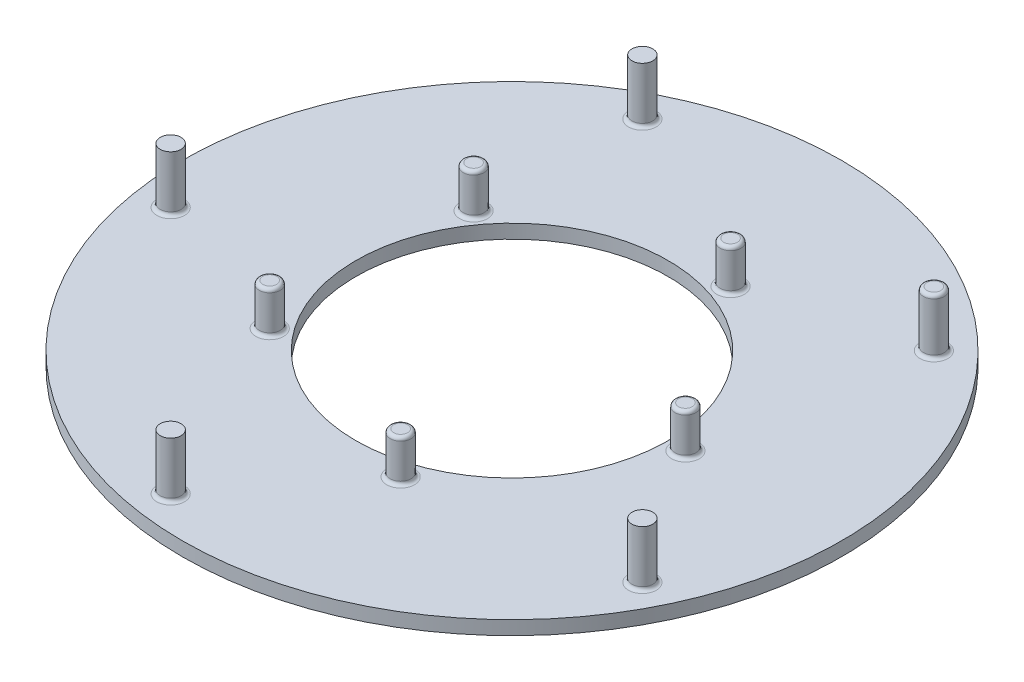
ISO-10303-21;
HEADER;
FILE_DESCRIPTION(('STEP AP214'),'2;1');
FILE_NAME('part.step','',(''),(''),'','','');
FILE_SCHEMA(('AUTOMOTIVE_DESIGN { 1 0 10303 214 1 1 1 1 }'));
ENDSEC;
DATA;
#1=APPLICATION_CONTEXT('core data for automotive mechanical design processes');
#2=APPLICATION_PROTOCOL_DEFINITION('international standard','automotive_design',2000,#1);
#3=PRODUCT_CONTEXT('',#1,'mechanical');
#4=PRODUCT('Part','Part','',(#3));
#5=PRODUCT_RELATED_PRODUCT_CATEGORY('part','',(#4));
#6=PRODUCT_DEFINITION_FORMATION('','',#4);
#7=PRODUCT_DEFINITION_CONTEXT('part definition',#1,'design');
#8=PRODUCT_DEFINITION('design','',#6,#7);
#9=PRODUCT_DEFINITION_SHAPE('','',#8);
#10=(LENGTH_UNIT() NAMED_UNIT(*) SI_UNIT(.MILLI.,.METRE.));
#11=(NAMED_UNIT(*) PLANE_ANGLE_UNIT() SI_UNIT($,.RADIAN.));
#12=(NAMED_UNIT(*) SI_UNIT($,.STERADIAN.) SOLID_ANGLE_UNIT());
#13=UNCERTAINTY_MEASURE_WITH_UNIT(LENGTH_MEASURE(1.E-05),#10,'distance_accuracy_value','');
#14=(GEOMETRIC_REPRESENTATION_CONTEXT(3) GLOBAL_UNCERTAINTY_ASSIGNED_CONTEXT((#13)) GLOBAL_UNIT_ASSIGNED_CONTEXT((#10,
#11,#12)) REPRESENTATION_CONTEXT('',''));
#15=CARTESIAN_POINT('',(0.,0.,0.));
#16=DIRECTION('',(0.,0.,1.));
#17=DIRECTION('',(1.,0.,0.));
#18=AXIS2_PLACEMENT_3D('',#15,#16,#17);
#19=CARTESIAN_POINT('',(0.,2.,0.));
#20=DIRECTION('',(0.,1.,0.));
#21=DIRECTION('',(0.,0.,1.));
#22=AXIS2_PLACEMENT_3D('',#19,#20,#21);
#23=PLANE('',#22);
#24=CARTESIAN_POINT('',(38.3132805401001,2.,19.5215914888));
#25=DIRECTION('',(0.,1.,0.));
#26=DIRECTION('',(0.,0.,1.));
#27=AXIS2_PLACEMENT_3D('',#24,#25,#26);
#28=CIRCLE('',#27,2.00000000000001);
#29=CARTESIAN_POINT('',(38.3132805401001,2.,21.5215914888));
#30=VERTEX_POINT('',#29);
#31=EDGE_CURVE('E10',#30,#30,#28,.F.);
#32=ORIENTED_EDGE('',*,*,#31,.T.);
#33=EDGE_LOOP('',(#32));
#34=FACE_BOUND('',#33,.T.);
#35=CARTESIAN_POINT('',(7.72542485937396,2.,23.7764129073788));
#36=DIRECTION('',(0.,1.,0.));
#37=DIRECTION('',(0.,0.,1.));
#38=AXIS2_PLACEMENT_3D('',#35,#36,#37);
#39=CIRCLE('',#38,2.);
#40=CARTESIAN_POINT('',(7.72542485937396,2.,25.7764129073788));
#41=VERTEX_POINT('',#40);
#42=EDGE_CURVE('E40',#41,#41,#39,.F.);
#43=ORIENTED_EDGE('',*,*,#42,.T.);
#44=EDGE_LOOP('',(#43));
#45=FACE_BOUND('',#44,.T.);
#46=CARTESIAN_POINT('',(-6.72668199672947,2.,42.470598645591));
#47=DIRECTION('',(0.,1.,0.));
#48=DIRECTION('',(0.,0.,1.));
#49=AXIS2_PLACEMENT_3D('',#46,#47,#48);
#50=CIRCLE('',#49,2.00000000000001);
#51=CARTESIAN_POINT('',(-6.72668199672947,2.,44.470598645591));
#52=VERTEX_POINT('',#51);
#53=EDGE_CURVE('E59',#52,#52,#50,.F.);
#54=ORIENTED_EDGE('',*,*,#53,.T.);
#55=EDGE_LOOP('',(#54));
#56=FACE_BOUND('',#55,.T.);
#57=CARTESIAN_POINT('',(-20.2254248593736,2.,14.694631307312));
#58=DIRECTION('',(0.,1.,0.));
#59=DIRECTION('',(0.,0.,1.));
#60=AXIS2_PLACEMENT_3D('',#57,#58,#59);
#61=CIRCLE('',#60,2.);
#62=CARTESIAN_POINT('',(-20.2254248593736,2.,16.694631307312));
#63=VERTEX_POINT('',#62);
#64=EDGE_CURVE('E62',#63,#63,#61,.F.);
#65=ORIENTED_EDGE('',*,*,#64,.T.);
#66=EDGE_LOOP('',(#65));
#67=FACE_BOUND('',#66,.T.);
#68=CARTESIAN_POINT('',(-42.4705986455909,2.,6.72668199673025));
#69=DIRECTION('',(0.,1.,0.));
#70=DIRECTION('',(0.,0.,1.));
#71=AXIS2_PLACEMENT_3D('',#68,#69,#70);
#72=CIRCLE('',#71,2.00000000000001);
#73=CARTESIAN_POINT('',(-42.4705986455909,2.,8.72668199673025));
#74=VERTEX_POINT('',#73);
#75=EDGE_CURVE('E77',#74,#74,#72,.F.);
#76=ORIENTED_EDGE('',*,*,#75,.T.);
#77=EDGE_LOOP('',(#76));
#78=FACE_BOUND('',#77,.T.);
#79=CARTESIAN_POINT('',(-20.2254248593738,2.,-14.6946313073117));
#80=DIRECTION('',(0.,1.,0.));
#81=DIRECTION('',(0.,0.,1.));
#82=AXIS2_PLACEMENT_3D('',#79,#80,#81);
#83=CIRCLE('',#82,2.);
#84=CARTESIAN_POINT('',(-20.2254248593738,2.,-12.6946313073117));
#85=VERTEX_POINT('',#84);
#86=EDGE_CURVE('E80',#85,#85,#83,.F.);
#87=ORIENTED_EDGE('',*,*,#86,.T.);
#88=EDGE_LOOP('',(#87));
#89=FACE_BOUND('',#88,.T.);
#90=CARTESIAN_POINT('',(-19.5215914888007,2.,-38.3132805400997));
#91=DIRECTION('',(0.,1.,0.));
#92=DIRECTION('',(0.,0.,1.));
#93=AXIS2_PLACEMENT_3D('',#90,#91,#92);
#94=CIRCLE('',#93,2.00000000000001);
#95=CARTESIAN_POINT('',(-19.5215914888007,2.,-36.3132805400997));
#96=VERTEX_POINT('',#95);
#97=EDGE_CURVE('E95',#96,#96,#94,.F.);
#98=ORIENTED_EDGE('',*,*,#97,.T.);
#99=EDGE_LOOP('',(#98));
#100=FACE_BOUND('',#99,.T.);
#101=CARTESIAN_POINT('',(7.72542485937362,2.,-23.7764129073789));
#102=DIRECTION('',(0.,1.,0.));
#103=DIRECTION('',(0.,0.,1.));
#104=AXIS2_PLACEMENT_3D('',#101,#102,#103);
#105=CIRCLE('',#104,2.);
#106=CARTESIAN_POINT('',(7.72542485937362,2.,-21.7764129073789));
#107=VERTEX_POINT('',#106);
#108=EDGE_CURVE('E98',#107,#107,#105,.F.);
#109=ORIENTED_EDGE('',*,*,#108,.T.);
#110=EDGE_LOOP('',(#109));
#111=FACE_BOUND('',#110,.T.);
#112=CARTESIAN_POINT('',(30.4055915910215,2.,-30.4055915910216));
#113=DIRECTION('',(0.,1.,0.));
#114=DIRECTION('',(0.,0.,1.));
#115=AXIS2_PLACEMENT_3D('',#112,#113,#114);
#116=CIRCLE('',#115,2.00000000000001);
#117=CARTESIAN_POINT('',(30.4055915910215,2.,-28.4055915910216));
#118=VERTEX_POINT('',#117);
#119=EDGE_CURVE('E119',#118,#118,#116,.F.);
#120=ORIENTED_EDGE('',*,*,#119,.T.);
#121=EDGE_LOOP('',(#120));
#122=FACE_BOUND('',#121,.T.);
#123=CARTESIAN_POINT('',(25.,2.,0.));
#124=DIRECTION('',(0.,1.,0.));
#125=DIRECTION('',(0.,0.,1.));
#126=AXIS2_PLACEMENT_3D('',#123,#124,#125);
#127=CIRCLE('',#126,2.);
#128=CARTESIAN_POINT('',(25.,2.,2.));
#129=VERTEX_POINT('',#128);
#130=EDGE_CURVE('E122',#129,#129,#127,.F.);
#131=ORIENTED_EDGE('',*,*,#130,.T.);
#132=EDGE_LOOP('',(#131));
#133=FACE_BOUND('',#132,.T.);
#134=CARTESIAN_POINT('',(0.,2.,0.));
#135=DIRECTION('',(0.,1.,0.));
#136=DIRECTION('',(0.,0.,1.));
#137=AXIS2_PLACEMENT_3D('',#134,#135,#136);
#138=CIRCLE('',#137,47.5);
#139=CARTESIAN_POINT('',(0.,2.,47.5));
#140=VERTEX_POINT('',#139);
#141=EDGE_CURVE('E137',#140,#140,#138,.T.);
#142=ORIENTED_EDGE('',*,*,#141,.T.);
#143=EDGE_LOOP('',(#142));
#144=FACE_BOUND('',#143,.T.);
#145=CARTESIAN_POINT('',(0.,2.,0.));
#146=DIRECTION('',(0.,1.,0.));
#147=DIRECTION('',(0.,0.,1.));
#148=AXIS2_PLACEMENT_3D('',#145,#146,#147);
#149=CIRCLE('',#148,22.5);
#150=CARTESIAN_POINT('',(0.,2.,22.5));
#151=VERTEX_POINT('',#150);
#152=EDGE_CURVE('E141',#151,#151,#149,.T.);
#153=ORIENTED_EDGE('',*,*,#152,.F.);
#154=EDGE_LOOP('',(#153));
#155=FACE_BOUND('',#154,.T.);
#156=ADVANCED_FACE('F33',(#34,#45,#56,#67,#78,#89,#100,#111,#122,#133,#144,#155),#23,.T.);
#157=CARTESIAN_POINT('',(0.,0.,0.));
#158=DIRECTION('',(0.,1.,0.));
#159=DIRECTION('',(0.,0.,1.));
#160=AXIS2_PLACEMENT_3D('',#157,#158,#159);
#161=PLANE('',#160);
#162=CARTESIAN_POINT('',(0.,0.,0.));
#163=DIRECTION('',(0.,1.,0.));
#164=DIRECTION('',(0.,0.,1.));
#165=AXIS2_PLACEMENT_3D('',#162,#163,#164);
#166=CIRCLE('',#165,47.5);
#167=CARTESIAN_POINT('',(0.,0.,47.5));
#168=VERTEX_POINT('',#167);
#169=EDGE_CURVE('E138',#168,#168,#166,.T.);
#170=ORIENTED_EDGE('',*,*,#169,.F.);
#171=EDGE_LOOP('',(#170));
#172=FACE_BOUND('',#171,.T.);
#173=CARTESIAN_POINT('',(0.,0.,0.));
#174=DIRECTION('',(0.,1.,0.));
#175=DIRECTION('',(0.,0.,1.));
#176=AXIS2_PLACEMENT_3D('',#173,#174,#175);
#177=CIRCLE('',#176,22.5);
#178=CARTESIAN_POINT('',(0.,0.,22.5));
#179=VERTEX_POINT('',#178);
#180=EDGE_CURVE('E144',#179,#179,#177,.T.);
#181=ORIENTED_EDGE('',*,*,#180,.T.);
#182=EDGE_LOOP('',(#181));
#183=FACE_BOUND('',#182,.T.);
#184=ADVANCED_FACE('F182',(#172,#183),#161,.F.);
#185=CARTESIAN_POINT('',(0.,2.,0.));
#186=DIRECTION('',(0.,-1.,0.));
#187=DIRECTION('',(0.,0.,-1.));
#188=AXIS2_PLACEMENT_3D('',#185,#186,#187);
#189=CYLINDRICAL_SURFACE('',#188,47.5);
#190=ORIENTED_EDGE('',*,*,#141,.F.);
#191=EDGE_LOOP('',(#190));
#192=FACE_BOUND('',#191,.T.);
#193=ORIENTED_EDGE('',*,*,#169,.T.);
#194=EDGE_LOOP('',(#193));
#195=FACE_BOUND('',#194,.T.);
#196=ADVANCED_FACE('F187',(#192,#195),#189,.T.);
#197=CARTESIAN_POINT('',(0.,2.,0.));
#198=DIRECTION('',(0.,-1.,0.));
#199=DIRECTION('',(0.,0.,-1.));
#200=AXIS2_PLACEMENT_3D('',#197,#198,#199);
#201=CYLINDRICAL_SURFACE('',#200,22.5);
#202=ORIENTED_EDGE('',*,*,#152,.T.);
#203=EDGE_LOOP('',(#202));
#204=FACE_BOUND('',#203,.T.);
#205=ORIENTED_EDGE('',*,*,#180,.F.);
#206=EDGE_LOOP('',(#205));
#207=FACE_BOUND('',#206,.T.);
#208=ADVANCED_FACE('F191',(#204,#207),#201,.F.);
#209=CARTESIAN_POINT('',(25.,8.,0.));
#210=DIRECTION('',(0.,-1.,0.));
#211=DIRECTION('',(0.,0.,-1.));
#212=AXIS2_PLACEMENT_3D('',#209,#210,#211);
#213=CYLINDRICAL_SURFACE('',#212,1.5);
#214=CARTESIAN_POINT('',(25.,7.5,0.));
#215=DIRECTION('',(0.,1.,0.));
#216=DIRECTION('',(0.,0.,1.));
#217=AXIS2_PLACEMENT_3D('',#214,#215,#216);
#218=CIRCLE('',#217,1.5);
#219=CARTESIAN_POINT('',(25.,7.5,1.5));
#220=VERTEX_POINT('',#219);
#221=EDGE_CURVE('E128',#220,#220,#218,.F.);
#222=ORIENTED_EDGE('',*,*,#221,.T.);
#223=EDGE_LOOP('',(#222));
#224=FACE_BOUND('',#223,.T.);
#225=CARTESIAN_POINT('',(25.,2.5,0.));
#226=DIRECTION('',(0.,1.,0.));
#227=DIRECTION('',(0.,0.,1.));
#228=AXIS2_PLACEMENT_3D('',#225,#226,#227);
#229=CIRCLE('',#228,1.5);
#230=CARTESIAN_POINT('',(25.,2.5,1.5));
#231=VERTEX_POINT('',#230);
#232=EDGE_CURVE('E131',#231,#231,#229,.T.);
#233=ORIENTED_EDGE('',*,*,#232,.T.);
#234=EDGE_LOOP('',(#233));
#235=FACE_BOUND('',#234,.T.);
#236=ADVANCED_FACE('F317',(#224,#235),#213,.T.);
#237=CARTESIAN_POINT('',(25.,8.,0.));
#238=DIRECTION('',(0.,1.,0.));
#239=DIRECTION('',(0.,0.,1.));
#240=AXIS2_PLACEMENT_3D('',#237,#238,#239);
#241=PLANE('',#240);
#242=CARTESIAN_POINT('',(25.,8.,0.));
#243=DIRECTION('',(0.,1.,0.));
#244=DIRECTION('',(0.,0.,1.));
#245=AXIS2_PLACEMENT_3D('',#242,#243,#244);
#246=CIRCLE('',#245,1.);
#247=CARTESIAN_POINT('',(25.,8.,1.));
#248=VERTEX_POINT('',#247);
#249=EDGE_CURVE('E134',#248,#248,#246,.T.);
#250=ORIENTED_EDGE('',*,*,#249,.T.);
#251=EDGE_LOOP('',(#250));
#252=FACE_BOUND('',#251,.T.);
#253=ADVANCED_FACE('F314',(#252),#241,.T.);
#254=CARTESIAN_POINT('',(30.4055915910215,8.,-30.4055915910216));
#255=DIRECTION('',(0.,-1.,0.));
#256=DIRECTION('',(0.,0.,-1.));
#257=AXIS2_PLACEMENT_3D('',#254,#255,#256);
#258=CYLINDRICAL_SURFACE('',#257,1.50000000000001);
#259=CARTESIAN_POINT('',(30.4055915910215,9.5,-30.4055915910216));
#260=DIRECTION('',(0.,1.,0.));
#261=DIRECTION('',(0.,0.,1.));
#262=AXIS2_PLACEMENT_3D('',#259,#260,#261);
#263=CIRCLE('',#262,1.50000000000001);
#264=CARTESIAN_POINT('',(30.4055915910215,9.5,-28.9055915910216));
#265=VERTEX_POINT('',#264);
#266=EDGE_CURVE('E113',#265,#265,#263,.F.);
#267=ORIENTED_EDGE('',*,*,#266,.T.);
#268=EDGE_LOOP('',(#267));
#269=FACE_BOUND('',#268,.T.);
#270=CARTESIAN_POINT('',(30.4055915910215,2.5,-30.4055915910216));
#271=DIRECTION('',(0.,1.,0.));
#272=DIRECTION('',(0.,0.,1.));
#273=AXIS2_PLACEMENT_3D('',#270,#271,#272);
#274=CIRCLE('',#273,1.50000000000001);
#275=CARTESIAN_POINT('',(30.4055915910215,2.5,-28.9055915910216));
#276=VERTEX_POINT('',#275);
#277=EDGE_CURVE('E125',#276,#276,#274,.T.);
#278=ORIENTED_EDGE('',*,*,#277,.T.);
#279=EDGE_LOOP('',(#278));
#280=FACE_BOUND('',#279,.T.);
#281=ADVANCED_FACE('F201',(#269,#280),#258,.T.);
#282=CARTESIAN_POINT('',(25.,7.5,0.));
#283=DIRECTION('',(0.,1.,0.));
#284=DIRECTION('',(0.,0.,1.));
#285=AXIS2_PLACEMENT_3D('',#282,#283,#284);
#286=TOROIDAL_SURFACE('',#285,1.,0.5);
#287=ORIENTED_EDGE('',*,*,#221,.F.);
#288=EDGE_LOOP('',(#287));
#289=FACE_BOUND('',#288,.T.);
#290=ORIENTED_EDGE('',*,*,#249,.F.);
#291=EDGE_LOOP('',(#290));
#292=FACE_BOUND('',#291,.T.);
#293=ADVANCED_FACE('F197',(#289,#292),#286,.T.);
#294=CARTESIAN_POINT('',(30.4055915910215,2.5,-30.4055915910216));
#295=DIRECTION('',(0.,1.,0.));
#296=DIRECTION('',(0.,0.,1.));
#297=AXIS2_PLACEMENT_3D('',#294,#295,#296);
#298=TOROIDAL_SURFACE('',#297,2.00000000000001,0.5);
#299=ORIENTED_EDGE('',*,*,#119,.F.);
#300=EDGE_LOOP('',(#299));
#301=FACE_BOUND('',#300,.T.);
#302=ORIENTED_EDGE('',*,*,#277,.F.);
#303=EDGE_LOOP('',(#302));
#304=FACE_BOUND('',#303,.T.);
#305=ADVANCED_FACE('F200',(#301,#304),#298,.F.);
#306=CARTESIAN_POINT('',(25.,2.5,0.));
#307=DIRECTION('',(0.,1.,0.));
#308=DIRECTION('',(0.,0.,1.));
#309=AXIS2_PLACEMENT_3D('',#306,#307,#308);
#310=TOROIDAL_SURFACE('',#309,2.,0.5);
#311=ORIENTED_EDGE('',*,*,#130,.F.);
#312=EDGE_LOOP('',(#311));
#313=FACE_BOUND('',#312,.T.);
#314=ORIENTED_EDGE('',*,*,#232,.F.);
#315=EDGE_LOOP('',(#314));
#316=FACE_BOUND('',#315,.T.);
#317=ADVANCED_FACE('F205',(#313,#316),#310,.F.);
#318=CARTESIAN_POINT('',(30.4055915910215,10.,-30.4055915910216));
#319=DIRECTION('',(0.,1.,0.));
#320=DIRECTION('',(0.,0.,1.));
#321=AXIS2_PLACEMENT_3D('',#318,#319,#320);
#322=PLANE('',#321);
#323=CARTESIAN_POINT('',(30.4055915910215,10.,-30.4055915910216));
#324=DIRECTION('',(0.,1.,0.));
#325=DIRECTION('',(0.,0.,1.));
#326=AXIS2_PLACEMENT_3D('',#323,#324,#325);
#327=CIRCLE('',#326,1.00000000000001);
#328=CARTESIAN_POINT('',(30.4055915910215,10.,-29.4055915910216));
#329=VERTEX_POINT('',#328);
#330=EDGE_CURVE('E116',#329,#329,#327,.T.);
#331=ORIENTED_EDGE('',*,*,#330,.T.);
#332=EDGE_LOOP('',(#331));
#333=FACE_BOUND('',#332,.T.);
#334=ADVANCED_FACE('F209',(#333),#322,.T.);
#335=CARTESIAN_POINT('',(30.4055915910215,9.5,-30.4055915910216));
#336=DIRECTION('',(0.,1.,0.));
#337=DIRECTION('',(0.,0.,1.));
#338=AXIS2_PLACEMENT_3D('',#335,#336,#337);
#339=TOROIDAL_SURFACE('',#338,1.00000000000001,0.5);
#340=ORIENTED_EDGE('',*,*,#266,.F.);
#341=EDGE_LOOP('',(#340));
#342=FACE_BOUND('',#341,.T.);
#343=ORIENTED_EDGE('',*,*,#330,.F.);
#344=EDGE_LOOP('',(#343));
#345=FACE_BOUND('',#344,.T.);
#346=ADVANCED_FACE('F211',(#342,#345),#339,.T.);
#347=CARTESIAN_POINT('',(7.72542485937362,8.,-23.7764129073789));
#348=DIRECTION('',(0.,-1.,0.));
#349=DIRECTION('',(0.,0.,-1.));
#350=AXIS2_PLACEMENT_3D('',#347,#348,#349);
#351=CYLINDRICAL_SURFACE('',#350,1.5);
#352=CARTESIAN_POINT('',(7.72542485937362,7.5,-23.7764129073789));
#353=DIRECTION('',(0.,1.,0.));
#354=DIRECTION('',(0.,0.,1.));
#355=AXIS2_PLACEMENT_3D('',#352,#353,#354);
#356=CIRCLE('',#355,1.5);
#357=CARTESIAN_POINT('',(7.72542485937362,7.5,-22.2764129073789));
#358=VERTEX_POINT('',#357);
#359=EDGE_CURVE('E104',#358,#358,#356,.F.);
#360=ORIENTED_EDGE('',*,*,#359,.T.);
#361=EDGE_LOOP('',(#360));
#362=FACE_BOUND('',#361,.T.);
#363=CARTESIAN_POINT('',(7.72542485937362,2.5,-23.7764129073789));
#364=DIRECTION('',(0.,1.,0.));
#365=DIRECTION('',(0.,0.,1.));
#366=AXIS2_PLACEMENT_3D('',#363,#364,#365);
#367=CIRCLE('',#366,1.5);
#368=CARTESIAN_POINT('',(7.72542485937362,2.5,-22.2764129073789));
#369=VERTEX_POINT('',#368);
#370=EDGE_CURVE('E107',#369,#369,#367,.T.);
#371=ORIENTED_EDGE('',*,*,#370,.T.);
#372=EDGE_LOOP('',(#371));
#373=FACE_BOUND('',#372,.T.);
#374=ADVANCED_FACE('F213',(#362,#373),#351,.T.);
#375=CARTESIAN_POINT('',(7.72542485937362,8.,-23.7764129073789));
#376=DIRECTION('',(0.,1.,0.));
#377=DIRECTION('',(0.951056516295155,0.,0.309016994374945));
#378=AXIS2_PLACEMENT_3D('',#375,#376,#377);
#379=PLANE('',#378);
#380=CARTESIAN_POINT('',(7.72542485937362,8.,-23.7764129073789));
#381=DIRECTION('',(0.,1.,0.));
#382=DIRECTION('',(0.,0.,1.));
#383=AXIS2_PLACEMENT_3D('',#380,#381,#382);
#384=CIRCLE('',#383,1.);
#385=CARTESIAN_POINT('',(7.72542485937362,8.,-22.7764129073789));
#386=VERTEX_POINT('',#385);
#387=EDGE_CURVE('E110',#386,#386,#384,.T.);
#388=ORIENTED_EDGE('',*,*,#387,.T.);
#389=EDGE_LOOP('',(#388));
#390=FACE_BOUND('',#389,.T.);
#391=ADVANCED_FACE('F301',(#390),#379,.T.);
#392=CARTESIAN_POINT('',(-19.5215914888007,8.,-38.3132805400997));
#393=DIRECTION('',(0.,-1.,0.));
#394=DIRECTION('',(0.,0.,-1.));
#395=AXIS2_PLACEMENT_3D('',#392,#393,#394);
#396=CYLINDRICAL_SURFACE('',#395,1.50000000000001);
#397=CARTESIAN_POINT('',(-19.5215914888007,2.5,-38.3132805400997));
#398=DIRECTION('',(0.,1.,0.));
#399=DIRECTION('',(0.,0.,1.));
#400=AXIS2_PLACEMENT_3D('',#397,#398,#399);
#401=CIRCLE('',#400,1.50000000000001);
#402=CARTESIAN_POINT('',(-19.5215914888007,2.5,-36.8132805400997));
#403=VERTEX_POINT('',#402);
#404=EDGE_CURVE('E101',#403,#403,#401,.T.);
#405=ORIENTED_EDGE('',*,*,#404,.T.);
#406=EDGE_LOOP('',(#405));
#407=FACE_BOUND('',#406,.T.);
#408=CARTESIAN_POINT('',(-19.5215914888007,10.,-38.3132805400997));
#409=DIRECTION('',(0.,1.,0.));
#410=DIRECTION('',(0.951056516295155,0.,0.309016994374945));
#411=AXIS2_PLACEMENT_3D('',#408,#409,#410);
#412=CIRCLE('',#411,1.50000000000001);
#413=CARTESIAN_POINT('',(-18.095006714358,10.,-37.8497550485373));
#414=VERTEX_POINT('',#413);
#415=EDGE_CURVE('E147',#414,#414,#412,.T.);
#416=ORIENTED_EDGE('',*,*,#415,.F.);
#417=EDGE_LOOP('',(#416));
#418=FACE_BOUND('',#417,.T.);
#419=ADVANCED_FACE('F297',(#407,#418),#396,.T.);
#420=CARTESIAN_POINT('',(-20.2254248593738,8.,-14.6946313073117));
#421=DIRECTION('',(0.,-1.,0.));
#422=DIRECTION('',(0.,0.,-1.));
#423=AXIS2_PLACEMENT_3D('',#420,#421,#422);
#424=CYLINDRICAL_SURFACE('',#423,1.5);
#425=CARTESIAN_POINT('',(-20.2254248593738,7.5,-14.6946313073117));
#426=DIRECTION('',(0.,1.,0.));
#427=DIRECTION('',(0.,0.,1.));
#428=AXIS2_PLACEMENT_3D('',#425,#426,#427);
#429=CIRCLE('',#428,1.5);
#430=CARTESIAN_POINT('',(-20.2254248593738,7.5,-13.1946313073117));
#431=VERTEX_POINT('',#430);
#432=EDGE_CURVE('E86',#431,#431,#429,.F.);
#433=ORIENTED_EDGE('',*,*,#432,.T.);
#434=EDGE_LOOP('',(#433));
#435=FACE_BOUND('',#434,.T.);
#436=CARTESIAN_POINT('',(-20.2254248593738,2.5,-14.6946313073117));
#437=DIRECTION('',(0.,1.,0.));
#438=DIRECTION('',(0.,0.,1.));
#439=AXIS2_PLACEMENT_3D('',#436,#437,#438);
#440=CIRCLE('',#439,1.5);
#441=CARTESIAN_POINT('',(-20.2254248593738,2.5,-13.1946313073117));
#442=VERTEX_POINT('',#441);
#443=EDGE_CURVE('E89',#442,#442,#440,.T.);
#444=ORIENTED_EDGE('',*,*,#443,.T.);
#445=EDGE_LOOP('',(#444));
#446=FACE_BOUND('',#445,.T.);
#447=ADVANCED_FACE('F293',(#435,#446),#424,.T.);
#448=CARTESIAN_POINT('',(-20.2254248593738,8.,-14.6946313073117));
#449=DIRECTION('',(0.,1.,0.));
#450=DIRECTION('',(0.587785252292469,0.,-0.809016994374951));
#451=AXIS2_PLACEMENT_3D('',#448,#449,#450);
#452=PLANE('',#451);
#453=CARTESIAN_POINT('',(-20.2254248593738,8.,-14.6946313073117));
#454=DIRECTION('',(0.,1.,0.));
#455=DIRECTION('',(0.,0.,1.));
#456=AXIS2_PLACEMENT_3D('',#453,#454,#455);
#457=CIRCLE('',#456,1.);
#458=CARTESIAN_POINT('',(-20.2254248593738,8.,-13.6946313073117));
#459=VERTEX_POINT('',#458);
#460=EDGE_CURVE('E92',#459,#459,#457,.T.);
#461=ORIENTED_EDGE('',*,*,#460,.T.);
#462=EDGE_LOOP('',(#461));
#463=FACE_BOUND('',#462,.T.);
#464=ADVANCED_FACE('F289',(#463),#452,.T.);
#465=CARTESIAN_POINT('',(-42.4705986455909,8.,6.72668199673025));
#466=DIRECTION('',(0.,-1.,0.));
#467=DIRECTION('',(0.,0.,-1.));
#468=AXIS2_PLACEMENT_3D('',#465,#466,#467);
#469=CYLINDRICAL_SURFACE('',#468,1.50000000000001);
#470=CARTESIAN_POINT('',(-42.4705986455909,2.5,6.72668199673025));
#471=DIRECTION('',(0.,1.,0.));
#472=DIRECTION('',(0.,0.,1.));
#473=AXIS2_PLACEMENT_3D('',#470,#471,#472);
#474=CIRCLE('',#473,1.50000000000001);
#475=CARTESIAN_POINT('',(-42.4705986455909,2.5,8.22668199673026));
#476=VERTEX_POINT('',#475);
#477=EDGE_CURVE('E83',#476,#476,#474,.T.);
#478=ORIENTED_EDGE('',*,*,#477,.T.);
#479=EDGE_LOOP('',(#478));
#480=FACE_BOUND('',#479,.T.);
#481=CARTESIAN_POINT('',(-42.4705986455909,10.,6.72668199673025));
#482=DIRECTION('',(0.,1.,0.));
#483=DIRECTION('',(0.587785252292469,0.,-0.809016994374951));
#484=AXIS2_PLACEMENT_3D('',#481,#482,#483);
#485=CIRCLE('',#484,1.50000000000001);
#486=CARTESIAN_POINT('',(-41.5889207671522,10.,5.51315650516782));
#487=VERTEX_POINT('',#486);
#488=EDGE_CURVE('E152',#487,#487,#485,.T.);
#489=ORIENTED_EDGE('',*,*,#488,.F.);
#490=EDGE_LOOP('',(#489));
#491=FACE_BOUND('',#490,.T.);
#492=ADVANCED_FACE('F285',(#480,#491),#469,.T.);
#493=CARTESIAN_POINT('',(-20.2254248593736,8.,14.694631307312));
#494=DIRECTION('',(0.,-1.,0.));
#495=DIRECTION('',(0.,0.,-1.));
#496=AXIS2_PLACEMENT_3D('',#493,#494,#495);
#497=CYLINDRICAL_SURFACE('',#496,1.5);
#498=CARTESIAN_POINT('',(-20.2254248593736,7.5,14.694631307312));
#499=DIRECTION('',(0.,1.,0.));
#500=DIRECTION('',(0.,0.,1.));
#501=AXIS2_PLACEMENT_3D('',#498,#499,#500);
#502=CIRCLE('',#501,1.5);
#503=CARTESIAN_POINT('',(-20.2254248593736,7.5,16.194631307312));
#504=VERTEX_POINT('',#503);
#505=EDGE_CURVE('E68',#504,#504,#502,.F.);
#506=ORIENTED_EDGE('',*,*,#505,.T.);
#507=EDGE_LOOP('',(#506));
#508=FACE_BOUND('',#507,.T.);
#509=CARTESIAN_POINT('',(-20.2254248593736,2.5,14.694631307312));
#510=DIRECTION('',(0.,1.,0.));
#511=DIRECTION('',(0.,0.,1.));
#512=AXIS2_PLACEMENT_3D('',#509,#510,#511);
#513=CIRCLE('',#512,1.5);
#514=CARTESIAN_POINT('',(-20.2254248593736,2.5,16.194631307312));
#515=VERTEX_POINT('',#514);
#516=EDGE_CURVE('E71',#515,#515,#513,.T.);
#517=ORIENTED_EDGE('',*,*,#516,.T.);
#518=EDGE_LOOP('',(#517));
#519=FACE_BOUND('',#518,.T.);
#520=ADVANCED_FACE('F281',(#508,#519),#497,.T.);
#521=CARTESIAN_POINT('',(-20.2254248593736,8.,14.694631307312));
#522=DIRECTION('',(0.,1.,0.));
#523=DIRECTION('',(-0.58778525229248,0.,-0.809016994374942));
#524=AXIS2_PLACEMENT_3D('',#521,#522,#523);
#525=PLANE('',#524);
#526=CARTESIAN_POINT('',(-20.2254248593736,8.,14.694631307312));
#527=DIRECTION('',(0.,1.,0.));
#528=DIRECTION('',(0.,0.,1.));
#529=AXIS2_PLACEMENT_3D('',#526,#527,#528);
#530=CIRCLE('',#529,1.);
#531=CARTESIAN_POINT('',(-20.2254248593736,8.,15.694631307312));
#532=VERTEX_POINT('',#531);
#533=EDGE_CURVE('E74',#532,#532,#530,.T.);
#534=ORIENTED_EDGE('',*,*,#533,.T.);
#535=EDGE_LOOP('',(#534));
#536=FACE_BOUND('',#535,.T.);
#537=ADVANCED_FACE('F275',(#536),#525,.T.);
#538=CARTESIAN_POINT('',(-6.72668199672947,8.,42.470598645591));
#539=DIRECTION('',(0.,-1.,0.));
#540=DIRECTION('',(0.,0.,-1.));
#541=AXIS2_PLACEMENT_3D('',#538,#539,#540);
#542=CYLINDRICAL_SURFACE('',#541,1.50000000000001);
#543=CARTESIAN_POINT('',(-6.72668199672947,2.5,42.470598645591));
#544=DIRECTION('',(0.,1.,0.));
#545=DIRECTION('',(0.,0.,1.));
#546=AXIS2_PLACEMENT_3D('',#543,#544,#545);
#547=CIRCLE('',#546,1.50000000000001);
#548=CARTESIAN_POINT('',(-6.72668199672947,2.5,43.970598645591));
#549=VERTEX_POINT('',#548);
#550=EDGE_CURVE('E65',#549,#549,#547,.T.);
#551=ORIENTED_EDGE('',*,*,#550,.T.);
#552=EDGE_LOOP('',(#551));
#553=FACE_BOUND('',#552,.T.);
#554=CARTESIAN_POINT('',(-6.72668199672947,10.,42.470598645591));
#555=DIRECTION('',(0.,1.,0.));
#556=DIRECTION('',(-0.58778525229248,0.,-0.809016994374942));
#557=AXIS2_PLACEMENT_3D('',#554,#555,#556);
#558=CIRCLE('',#557,1.50000000000001);
#559=CARTESIAN_POINT('',(-7.6083598751682,10.,41.2570731540286));
#560=VERTEX_POINT('',#559);
#561=EDGE_CURVE('E155',#560,#560,#558,.T.);
#562=ORIENTED_EDGE('',*,*,#561,.F.);
#563=EDGE_LOOP('',(#562));
#564=FACE_BOUND('',#563,.T.);
#565=ADVANCED_FACE('F269',(#553,#564),#542,.T.);
#566=CARTESIAN_POINT('',(7.72542485937396,8.,23.7764129073788));
#567=DIRECTION('',(0.,-1.,0.));
#568=DIRECTION('',(0.,0.,-1.));
#569=AXIS2_PLACEMENT_3D('',#566,#567,#568);
#570=CYLINDRICAL_SURFACE('',#569,1.5);
#571=CARTESIAN_POINT('',(7.72542485937396,7.5,23.7764129073788));
#572=DIRECTION('',(0.,1.,0.));
#573=DIRECTION('',(0.,0.,1.));
#574=AXIS2_PLACEMENT_3D('',#571,#572,#573);
#575=CIRCLE('',#574,1.5);
#576=CARTESIAN_POINT('',(7.72542485937396,7.5,25.2764129073788));
#577=VERTEX_POINT('',#576);
#578=EDGE_CURVE('E48',#577,#577,#575,.F.);
#579=ORIENTED_EDGE('',*,*,#578,.T.);
#580=EDGE_LOOP('',(#579));
#581=FACE_BOUND('',#580,.T.);
#582=CARTESIAN_POINT('',(7.72542485937396,2.5,23.7764129073788));
#583=DIRECTION('',(0.,1.,0.));
#584=DIRECTION('',(0.,0.,1.));
#585=AXIS2_PLACEMENT_3D('',#582,#583,#584);
#586=CIRCLE('',#585,1.5);
#587=CARTESIAN_POINT('',(7.72542485937396,2.5,25.2764129073788));
#588=VERTEX_POINT('',#587);
#589=EDGE_CURVE('E53',#588,#588,#586,.T.);
#590=ORIENTED_EDGE('',*,*,#589,.T.);
#591=EDGE_LOOP('',(#590));
#592=FACE_BOUND('',#591,.T.);
#593=ADVANCED_FACE('F177',(#581,#592),#570,.T.);
#594=CARTESIAN_POINT('',(7.72542485937396,8.,23.7764129073788));
#595=DIRECTION('',(0.,1.,0.));
#596=DIRECTION('',(-0.95105651629515,0.,0.309016994374958));
#597=AXIS2_PLACEMENT_3D('',#594,#595,#596);
#598=PLANE('',#597);
#599=CARTESIAN_POINT('',(7.72542485937396,8.,23.7764129073788));
#600=DIRECTION('',(0.,1.,0.));
#601=DIRECTION('',(0.,0.,1.));
#602=AXIS2_PLACEMENT_3D('',#599,#600,#601);
#603=CIRCLE('',#602,1.);
#604=CARTESIAN_POINT('',(7.72542485937396,8.,24.7764129073788));
#605=VERTEX_POINT('',#604);
#606=EDGE_CURVE('E56',#605,#605,#603,.T.);
#607=ORIENTED_EDGE('',*,*,#606,.T.);
#608=EDGE_LOOP('',(#607));
#609=FACE_BOUND('',#608,.T.);
#610=ADVANCED_FACE('F167',(#609),#598,.T.);
#611=CARTESIAN_POINT('',(38.3132805401001,8.,19.5215914888));
#612=DIRECTION('',(0.,-1.,0.));
#613=DIRECTION('',(0.,0.,-1.));
#614=AXIS2_PLACEMENT_3D('',#611,#612,#613);
#615=CYLINDRICAL_SURFACE('',#614,1.50000000000001);
#616=CARTESIAN_POINT('',(38.3132805401001,2.5,19.5215914888));
#617=DIRECTION('',(0.,1.,0.));
#618=DIRECTION('',(0.,0.,1.));
#619=AXIS2_PLACEMENT_3D('',#616,#617,#618);
#620=CIRCLE('',#619,1.50000000000001);
#621=CARTESIAN_POINT('',(38.3132805401001,2.5,21.0215914888));
#622=VERTEX_POINT('',#621);
#623=EDGE_CURVE('E44',#622,#622,#620,.T.);
#624=ORIENTED_EDGE('',*,*,#623,.T.);
#625=EDGE_LOOP('',(#624));
#626=FACE_BOUND('',#625,.T.);
#627=CARTESIAN_POINT('',(38.3132805401001,10.,19.5215914888));
#628=DIRECTION('',(0.,1.,0.));
#629=DIRECTION('',(-0.95105651629515,0.,0.309016994374958));
#630=AXIS2_PLACEMENT_3D('',#627,#628,#629);
#631=CIRCLE('',#630,1.50000000000001);
#632=CARTESIAN_POINT('',(36.8866957656573,10.,19.9851169803624));
#633=VERTEX_POINT('',#632);
#634=EDGE_CURVE('E158',#633,#633,#631,.T.);
#635=ORIENTED_EDGE('',*,*,#634,.F.);
#636=EDGE_LOOP('',(#635));
#637=FACE_BOUND('',#636,.T.);
#638=ADVANCED_FACE('F164',(#626,#637),#615,.T.);
#639=CARTESIAN_POINT('',(7.72542485937362,7.5,-23.7764129073789));
#640=DIRECTION('',(0.,1.,0.));
#641=DIRECTION('',(0.,0.,1.));
#642=AXIS2_PLACEMENT_3D('',#639,#640,#641);
#643=TOROIDAL_SURFACE('',#642,1.,0.5);
#644=ORIENTED_EDGE('',*,*,#359,.F.);
#645=EDGE_LOOP('',(#644));
#646=FACE_BOUND('',#645,.T.);
#647=ORIENTED_EDGE('',*,*,#387,.F.);
#648=EDGE_LOOP('',(#647));
#649=FACE_BOUND('',#648,.T.);
#650=ADVANCED_FACE('F166',(#646,#649),#643,.T.);
#651=CARTESIAN_POINT('',(-19.5215914888007,2.5,-38.3132805400997));
#652=DIRECTION('',(0.,1.,0.));
#653=DIRECTION('',(0.,0.,1.));
#654=AXIS2_PLACEMENT_3D('',#651,#652,#653);
#655=TOROIDAL_SURFACE('',#654,2.00000000000001,0.5);
#656=ORIENTED_EDGE('',*,*,#97,.F.);
#657=EDGE_LOOP('',(#656));
#658=FACE_BOUND('',#657,.T.);
#659=ORIENTED_EDGE('',*,*,#404,.F.);
#660=EDGE_LOOP('',(#659));
#661=FACE_BOUND('',#660,.T.);
#662=ADVANCED_FACE('F174',(#658,#661),#655,.F.);
#663=CARTESIAN_POINT('',(7.72542485937362,2.5,-23.7764129073789));
#664=DIRECTION('',(0.,1.,0.));
#665=DIRECTION('',(0.,0.,1.));
#666=AXIS2_PLACEMENT_3D('',#663,#664,#665);
#667=TOROIDAL_SURFACE('',#666,2.,0.5);
#668=ORIENTED_EDGE('',*,*,#108,.F.);
#669=EDGE_LOOP('',(#668));
#670=FACE_BOUND('',#669,.T.);
#671=ORIENTED_EDGE('',*,*,#370,.F.);
#672=EDGE_LOOP('',(#671));
#673=FACE_BOUND('',#672,.T.);
#674=ADVANCED_FACE('F218',(#670,#673),#667,.F.);
#675=CARTESIAN_POINT('',(-20.2254248593738,7.5,-14.6946313073117));
#676=DIRECTION('',(0.,1.,0.));
#677=DIRECTION('',(0.,0.,1.));
#678=AXIS2_PLACEMENT_3D('',#675,#676,#677);
#679=TOROIDAL_SURFACE('',#678,1.,0.5);
#680=ORIENTED_EDGE('',*,*,#432,.F.);
#681=EDGE_LOOP('',(#680));
#682=FACE_BOUND('',#681,.T.);
#683=ORIENTED_EDGE('',*,*,#460,.F.);
#684=EDGE_LOOP('',(#683));
#685=FACE_BOUND('',#684,.T.);
#686=ADVANCED_FACE('F222',(#682,#685),#679,.T.);
#687=CARTESIAN_POINT('',(-42.4705986455909,2.5,6.72668199673025));
#688=DIRECTION('',(0.,1.,0.));
#689=DIRECTION('',(0.,0.,1.));
#690=AXIS2_PLACEMENT_3D('',#687,#688,#689);
#691=TOROIDAL_SURFACE('',#690,2.00000000000001,0.5);
#692=ORIENTED_EDGE('',*,*,#75,.F.);
#693=EDGE_LOOP('',(#692));
#694=FACE_BOUND('',#693,.T.);
#695=ORIENTED_EDGE('',*,*,#477,.F.);
#696=EDGE_LOOP('',(#695));
#697=FACE_BOUND('',#696,.T.);
#698=ADVANCED_FACE('F226',(#694,#697),#691,.F.);
#699=CARTESIAN_POINT('',(-20.2254248593738,2.5,-14.6946313073117));
#700=DIRECTION('',(0.,1.,0.));
#701=DIRECTION('',(0.,0.,1.));
#702=AXIS2_PLACEMENT_3D('',#699,#700,#701);
#703=TOROIDAL_SURFACE('',#702,2.,0.5);
#704=ORIENTED_EDGE('',*,*,#86,.F.);
#705=EDGE_LOOP('',(#704));
#706=FACE_BOUND('',#705,.T.);
#707=ORIENTED_EDGE('',*,*,#443,.F.);
#708=EDGE_LOOP('',(#707));
#709=FACE_BOUND('',#708,.T.);
#710=ADVANCED_FACE('F230',(#706,#709),#703,.F.);
#711=CARTESIAN_POINT('',(-20.2254248593736,7.5,14.694631307312));
#712=DIRECTION('',(0.,1.,0.));
#713=DIRECTION('',(0.,0.,1.));
#714=AXIS2_PLACEMENT_3D('',#711,#712,#713);
#715=TOROIDAL_SURFACE('',#714,1.,0.5);
#716=ORIENTED_EDGE('',*,*,#505,.F.);
#717=EDGE_LOOP('',(#716));
#718=FACE_BOUND('',#717,.T.);
#719=ORIENTED_EDGE('',*,*,#533,.F.);
#720=EDGE_LOOP('',(#719));
#721=FACE_BOUND('',#720,.T.);
#722=ADVANCED_FACE('F234',(#718,#721),#715,.T.);
#723=CARTESIAN_POINT('',(-6.72668199672947,2.5,42.470598645591));
#724=DIRECTION('',(0.,1.,0.));
#725=DIRECTION('',(0.,0.,1.));
#726=AXIS2_PLACEMENT_3D('',#723,#724,#725);
#727=TOROIDAL_SURFACE('',#726,2.00000000000001,0.5);
#728=ORIENTED_EDGE('',*,*,#53,.F.);
#729=EDGE_LOOP('',(#728));
#730=FACE_BOUND('',#729,.T.);
#731=ORIENTED_EDGE('',*,*,#550,.F.);
#732=EDGE_LOOP('',(#731));
#733=FACE_BOUND('',#732,.T.);
#734=ADVANCED_FACE('F238',(#730,#733),#727,.F.);
#735=CARTESIAN_POINT('',(-20.2254248593736,2.5,14.694631307312));
#736=DIRECTION('',(0.,1.,0.));
#737=DIRECTION('',(0.,0.,1.));
#738=AXIS2_PLACEMENT_3D('',#735,#736,#737);
#739=TOROIDAL_SURFACE('',#738,2.,0.5);
#740=ORIENTED_EDGE('',*,*,#64,.F.);
#741=EDGE_LOOP('',(#740));
#742=FACE_BOUND('',#741,.T.);
#743=ORIENTED_EDGE('',*,*,#516,.F.);
#744=EDGE_LOOP('',(#743));
#745=FACE_BOUND('',#744,.T.);
#746=ADVANCED_FACE('F242',(#742,#745),#739,.F.);
#747=CARTESIAN_POINT('',(7.72542485937396,7.5,23.7764129073788));
#748=DIRECTION('',(0.,1.,0.));
#749=DIRECTION('',(0.,0.,1.));
#750=AXIS2_PLACEMENT_3D('',#747,#748,#749);
#751=TOROIDAL_SURFACE('',#750,1.,0.5);
#752=ORIENTED_EDGE('',*,*,#578,.F.);
#753=EDGE_LOOP('',(#752));
#754=FACE_BOUND('',#753,.T.);
#755=ORIENTED_EDGE('',*,*,#606,.F.);
#756=EDGE_LOOP('',(#755));
#757=FACE_BOUND('',#756,.T.);
#758=ADVANCED_FACE('F246',(#754,#757),#751,.T.);
#759=CARTESIAN_POINT('',(38.3132805401001,2.5,19.5215914888));
#760=DIRECTION('',(0.,1.,0.));
#761=DIRECTION('',(0.,0.,1.));
#762=AXIS2_PLACEMENT_3D('',#759,#760,#761);
#763=TOROIDAL_SURFACE('',#762,2.00000000000001,0.5);
#764=ORIENTED_EDGE('',*,*,#31,.F.);
#765=EDGE_LOOP('',(#764));
#766=FACE_BOUND('',#765,.T.);
#767=ORIENTED_EDGE('',*,*,#623,.F.);
#768=EDGE_LOOP('',(#767));
#769=FACE_BOUND('',#768,.T.);
#770=ADVANCED_FACE('F249',(#766,#769),#763,.F.);
#771=CARTESIAN_POINT('',(7.72542485937396,2.5,23.7764129073788));
#772=DIRECTION('',(0.,1.,0.));
#773=DIRECTION('',(0.,0.,1.));
#774=AXIS2_PLACEMENT_3D('',#771,#772,#773);
#775=TOROIDAL_SURFACE('',#774,2.,0.5);
#776=ORIENTED_EDGE('',*,*,#42,.F.);
#777=EDGE_LOOP('',(#776));
#778=FACE_BOUND('',#777,.T.);
#779=ORIENTED_EDGE('',*,*,#589,.F.);
#780=EDGE_LOOP('',(#779));
#781=FACE_BOUND('',#780,.T.);
#782=ADVANCED_FACE('F35',(#778,#781),#775,.F.);
#783=CARTESIAN_POINT('',(-19.5215914888007,10.,-38.3132805400997));
#784=DIRECTION('',(0.,1.,0.));
#785=DIRECTION('',(0.951056516295155,0.,0.309016994374945));
#786=AXIS2_PLACEMENT_3D('',#783,#784,#785);
#787=PLANE('',#786);
#788=ORIENTED_EDGE('',*,*,#415,.T.);
#789=EDGE_LOOP('',(#788));
#790=FACE_BOUND('',#789,.T.);
#791=ADVANCED_FACE('F256',(#790),#787,.T.);
#792=CARTESIAN_POINT('',(-42.4705986455909,10.,6.72668199673025));
#793=DIRECTION('',(0.,1.,0.));
#794=DIRECTION('',(0.587785252292469,0.,-0.809016994374951));
#795=AXIS2_PLACEMENT_3D('',#792,#793,#794);
#796=PLANE('',#795);
#797=ORIENTED_EDGE('',*,*,#488,.T.);
#798=EDGE_LOOP('',(#797));
#799=FACE_BOUND('',#798,.T.);
#800=ADVANCED_FACE('F263',(#799),#796,.T.);
#801=CARTESIAN_POINT('',(-6.72668199672947,10.,42.470598645591));
#802=DIRECTION('',(0.,1.,0.));
#803=DIRECTION('',(-0.58778525229248,0.,-0.809016994374942));
#804=AXIS2_PLACEMENT_3D('',#801,#802,#803);
#805=PLANE('',#804);
#806=ORIENTED_EDGE('',*,*,#561,.T.);
#807=EDGE_LOOP('',(#806));
#808=FACE_BOUND('',#807,.T.);
#809=ADVANCED_FACE('F555',(#808),#805,.T.);
#810=CARTESIAN_POINT('',(38.3132805401001,10.,19.5215914888));
#811=DIRECTION('',(0.,1.,0.));
#812=DIRECTION('',(-0.95105651629515,0.,0.309016994374958));
#813=AXIS2_PLACEMENT_3D('',#810,#811,#812);
#814=PLANE('',#813);
#815=ORIENTED_EDGE('',*,*,#634,.T.);
#816=EDGE_LOOP('',(#815));
#817=FACE_BOUND('',#816,.T.);
#818=ADVANCED_FACE('F162',(#817),#814,.T.);
#819=CLOSED_SHELL('',(#156,#184,#196,#208,#236,#253,#281,#293,#305,#317,#334,#346,#374,#391,
#419,#447,#464,#492,#520,#537,#565,#593,#610,#638,#650,#662,#674,#686,#698,#710,#722,#734,#746,
#758,#770,#782,#791,#800,#809,#818));
#820=MANIFOLD_SOLID_BREP('B2',#819);
#821=ADVANCED_BREP_SHAPE_REPRESENTATION('',(#18,#820),#14);
#822=SHAPE_DEFINITION_REPRESENTATION(#9,#821);
ENDSEC;
END-ISO-10303-21;
